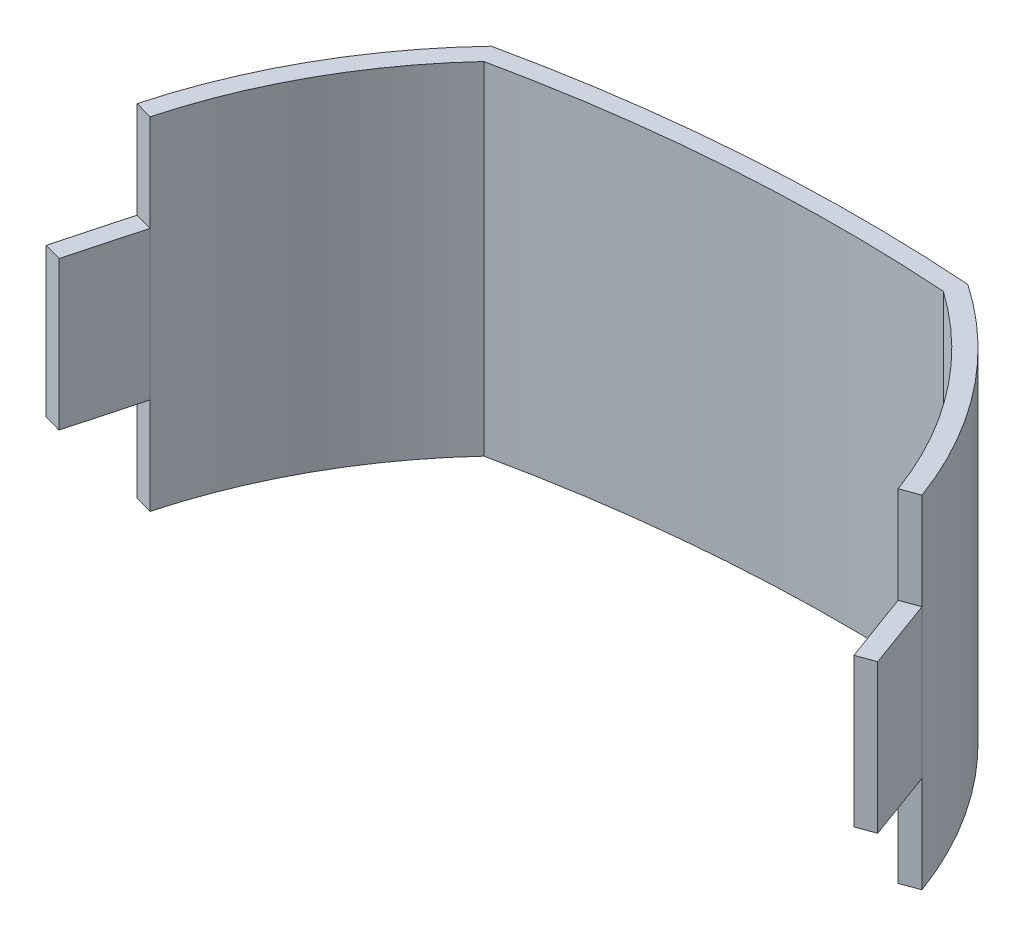
ISO-10303-21;
HEADER;
FILE_DESCRIPTION(('STEP AP214'),'2;1');
FILE_NAME('part.step','',(''),(''),'','','');
FILE_SCHEMA(('AUTOMOTIVE_DESIGN { 1 0 10303 214 1 1 1 1 }'));
ENDSEC;
DATA;
#1=APPLICATION_CONTEXT('core data for automotive mechanical design processes');
#2=APPLICATION_PROTOCOL_DEFINITION('international standard','automotive_design',2000,#1);
#3=PRODUCT_CONTEXT('',#1,'mechanical');
#4=PRODUCT('Part','Part','',(#3));
#5=PRODUCT_RELATED_PRODUCT_CATEGORY('part','',(#4));
#6=PRODUCT_DEFINITION_FORMATION('','',#4);
#7=PRODUCT_DEFINITION_CONTEXT('part definition',#1,'design');
#8=PRODUCT_DEFINITION('design','',#6,#7);
#9=PRODUCT_DEFINITION_SHAPE('','',#8);
#10=(LENGTH_UNIT() NAMED_UNIT(*) SI_UNIT(.MILLI.,.METRE.));
#11=(NAMED_UNIT(*) PLANE_ANGLE_UNIT() SI_UNIT($,.RADIAN.));
#12=(NAMED_UNIT(*) SI_UNIT($,.STERADIAN.) SOLID_ANGLE_UNIT());
#13=UNCERTAINTY_MEASURE_WITH_UNIT(LENGTH_MEASURE(1.E-05),#10,'distance_accuracy_value','');
#14=(GEOMETRIC_REPRESENTATION_CONTEXT(3) GLOBAL_UNCERTAINTY_ASSIGNED_CONTEXT((#13)) GLOBAL_UNIT_ASSIGNED_CONTEXT((#10,
#11,#12)) REPRESENTATION_CONTEXT('',''));
#15=CARTESIAN_POINT('',(0.,0.,0.));
#16=DIRECTION('',(0.,0.,1.));
#17=DIRECTION('',(1.,0.,0.));
#18=AXIS2_PLACEMENT_3D('',#15,#16,#17);
#19=CARTESIAN_POINT('',(-5.40390390607862,4.6275,1.4488803415211));
#20=DIRECTION('',(-0.261218836370593,0.,0.965279606914594));
#21=DIRECTION('',(0.965279606914594,0.,0.261218836370593));
#22=AXIS2_PLACEMENT_3D('',#19,#20,#21);
#23=PLANE('',#22);
#24=DIRECTION('',(0.,1.,0.));
#25=VECTOR('',#24,1.);
#26=CARTESIAN_POINT('',(-5.39425111000948,5.6375,1.45149252988481));
#27=LINE('',#26,#25);
#28=CARTESIAN_POINT('',(-5.39425111000948,4.6375,1.45149252988481));
#29=VERTEX_POINT('',#28);
#30=CARTESIAN_POINT('',(-5.39425111000948,6.6375,1.45149252988481));
#31=VERTEX_POINT('',#30);
#32=EDGE_CURVE('E228',#29,#31,#27,.T.);
#33=ORIENTED_EDGE('',*,*,#32,.F.);
#34=DIRECTION('',(-0.965279606914593,0.,-0.261218836370596));
#35=VECTOR('',#34,1.);
#36=CARTESIAN_POINT('',(-5.15293120828083,4.6375,1.51679723897746));
#37=LINE('',#36,#35);
#38=CARTESIAN_POINT('',(-5.15293120828083,4.6375,1.51679723897746));
#39=VERTEX_POINT('',#38);
#40=EDGE_CURVE('E252',#39,#29,#37,.T.);
#41=ORIENTED_EDGE('',*,*,#40,.F.);
#42=DIRECTION('',(0.,-1.,0.));
#43=VECTOR('',#42,1.);
#44=CARTESIAN_POINT('',(-5.15293120828084,5.6375,1.51679723897746));
#45=LINE('',#44,#43);
#46=CARTESIAN_POINT('',(-5.15293120828083,6.6375,1.51679723897746));
#47=VERTEX_POINT('',#46);
#48=EDGE_CURVE('E244',#47,#39,#45,.T.);
#49=ORIENTED_EDGE('',*,*,#48,.F.);
#50=DIRECTION('',(0.965279606914593,0.,0.261218836370596));
#51=VECTOR('',#50,1.);
#52=CARTESIAN_POINT('',(-5.39425111000948,6.6375,1.45149252988481));
#53=LINE('',#52,#51);
#54=EDGE_CURVE('E21',#31,#47,#53,.T.);
#55=ORIENTED_EDGE('',*,*,#54,.F.);
#56=EDGE_LOOP('',(#33,#41,#49,#55));
#57=FACE_BOUND('',#56,.T.);
#58=ADVANCED_FACE('F17',(#57),#23,.T.);
#59=CARTESIAN_POINT('',(-5.40425111000948,6.6375,0.476212922970216));
#60=DIRECTION('',(0.,1.,0.));
#61=DIRECTION('',(0.,0.,1.));
#62=AXIS2_PLACEMENT_3D('',#59,#60,#61);
#63=PLANE('',#62);
#64=DIRECTION('',(0.965279606914591,0.,0.261218836370605));
#65=VECTOR('',#64,1.);
#66=CARTESIAN_POINT('',(-5.01237232277455,6.6375,0.518865277516542));
#67=LINE('',#66,#65);
#68=CARTESIAN_POINT('',(-5.13303227363887,6.6375,0.486212922970215));
#69=VERTEX_POINT('',#68);
#70=CARTESIAN_POINT('',(-4.89171237191023,6.6375,0.551517632062868));
#71=VERTEX_POINT('',#70);
#72=EDGE_CURVE('E216',#69,#71,#67,.T.);
#73=ORIENTED_EDGE('',*,*,#72,.F.);
#74=DIRECTION('',(0.2612188363706,0.,-0.965279606914592));
#75=VECTOR('',#74,1.);
#76=CARTESIAN_POINT('',(-5.26364169182418,6.6375,0.96885272642751));
#77=LINE('',#76,#75);
#78=EDGE_CURVE('E225',#31,#69,#77,.T.);
#79=ORIENTED_EDGE('',*,*,#78,.F.);
#80=ORIENTED_EDGE('',*,*,#54,.T.);
#81=DIRECTION('',(-0.261218836370607,0.,0.96527960691459));
#82=VECTOR('',#81,1.);
#83=CARTESIAN_POINT('',(-5.02232179009553,6.6375,1.03415743552016));
#84=LINE('',#83,#82);
#85=EDGE_CURVE('E122',#71,#47,#84,.T.);
#86=ORIENTED_EDGE('',*,*,#85,.F.);
#87=EDGE_LOOP('',(#73,#79,#80,#86));
#88=FACE_BOUND('',#87,.T.);
#89=ADVANCED_FACE('F318',(#88),#63,.T.);
#90=CARTESIAN_POINT('',(-5.15554339664454,4.6275,1.5264500350466));
#91=DIRECTION('',(0.96527960691459,0.,0.261218836370607));
#92=DIRECTION('',(0.261218836370607,0.,-0.96527960691459));
#93=AXIS2_PLACEMENT_3D('',#90,#91,#92);
#94=PLANE('',#93);
#95=ORIENTED_EDGE('',*,*,#48,.T.);
#96=DIRECTION('',(-0.261218836370599,0.,0.965279606914592));
#97=VECTOR('',#96,1.);
#98=CARTESIAN_POINT('',(-4.89171237191023,4.6375,0.551517632062866));
#99=LINE('',#98,#97);
#100=CARTESIAN_POINT('',(-4.89171237191023,4.6375,0.551517632062867));
#101=VERTEX_POINT('',#100);
#102=EDGE_CURVE('E249',#101,#39,#99,.T.);
#103=ORIENTED_EDGE('',*,*,#102,.F.);
#104=DIRECTION('',(0.,-1.,0.));
#105=VECTOR('',#104,1.);
#106=CARTESIAN_POINT('',(-4.89171237191023,5.6375,0.551517632062868));
#107=LINE('',#106,#105);
#108=EDGE_CURVE('E203',#71,#101,#107,.T.);
#109=ORIENTED_EDGE('',*,*,#108,.F.);
#110=ORIENTED_EDGE('',*,*,#85,.T.);
#111=EDGE_LOOP('',(#95,#103,#109,#110));
#112=FACE_BOUND('',#111,.T.);
#113=ADVANCED_FACE('F317',(#112),#94,.T.);
#114=CARTESIAN_POINT('',(-5.40425111000948,4.6375,1.52679723897746));
#115=DIRECTION('',(0.,-1.,0.));
#116=DIRECTION('',(0.,0.,-1.));
#117=AXIS2_PLACEMENT_3D('',#114,#115,#116);
#118=PLANE('',#117);
#119=DIRECTION('',(-0.965279606914591,0.,-0.261218836370605));
#120=VECTOR('',#119,1.);
#121=CARTESIAN_POINT('',(-5.01237232277455,4.6375,0.518865277516542));
#122=LINE('',#121,#120);
#123=CARTESIAN_POINT('',(-5.13303227363887,4.6375,0.486212922970215));
#124=VERTEX_POINT('',#123);
#125=EDGE_CURVE('E188',#101,#124,#122,.T.);
#126=ORIENTED_EDGE('',*,*,#125,.F.);
#127=ORIENTED_EDGE('',*,*,#102,.T.);
#128=ORIENTED_EDGE('',*,*,#40,.T.);
#129=DIRECTION('',(-0.2612188363706,0.,0.965279606914592));
#130=VECTOR('',#129,1.);
#131=CARTESIAN_POINT('',(-5.26364169182418,4.6375,0.96885272642751));
#132=LINE('',#131,#130);
#133=EDGE_CURVE('E218',#124,#29,#132,.T.);
#134=ORIENTED_EDGE('',*,*,#133,.F.);
#135=EDGE_LOOP('',(#126,#127,#128,#134));
#136=FACE_BOUND('',#135,.T.);
#137=ADVANCED_FACE('F299',(#136),#118,.T.);
#138=CARTESIAN_POINT('',(-5.13042008527517,4.6275,0.47656012690107));
#139=DIRECTION('',(-0.965279606914592,0.,-0.2612188363706));
#140=DIRECTION('',(-0.2612188363706,0.,0.965279606914592));
#141=AXIS2_PLACEMENT_3D('',#138,#139,#140);
#142=PLANE('',#141);
#143=DIRECTION('',(0.,1.,0.));
#144=VECTOR('',#143,1.);
#145=CARTESIAN_POINT('',(-5.13303227363887,5.6375,0.486212922970215));
#146=LINE('',#145,#144);
#147=EDGE_CURVE('E182',#124,#69,#146,.T.);
#148=ORIENTED_EDGE('',*,*,#147,.F.);
#149=ORIENTED_EDGE('',*,*,#133,.T.);
#150=ORIENTED_EDGE('',*,*,#32,.T.);
#151=ORIENTED_EDGE('',*,*,#78,.T.);
#152=EDGE_LOOP('',(#148,#149,#150,#151));
#153=FACE_BOUND('',#152,.T.);
#154=ADVANCED_FACE('F302',(#153),#142,.T.);
#155=CARTESIAN_POINT('',(-5.14268506970802,6.6275,0.48360073460651));
#156=DIRECTION('',(-0.261218836370605,0.,0.965279606914591));
#157=DIRECTION('',(0.965279606914591,0.,0.261218836370605));
#158=AXIS2_PLACEMENT_3D('',#155,#156,#157);
#159=PLANE('',#158);
#160=DIRECTION('',(-0.965279606914591,0.,-0.261218836370605));
#161=VECTOR('',#160,1.);
#162=CARTESIAN_POINT('',(-5.01237232277455,7.9375,0.518865277516542));
#163=LINE('',#162,#161);
#164=CARTESIAN_POINT('',(-4.89171237191023,7.9375,0.551517632062867));
#165=VERTEX_POINT('',#164);
#166=CARTESIAN_POINT('',(-5.13303227363887,7.9375,0.486212922970217));
#167=VERTEX_POINT('',#166);
#168=EDGE_CURVE('E192',#165,#167,#163,.T.);
#169=ORIENTED_EDGE('',*,*,#168,.T.);
#170=DIRECTION('',(0.,1.,0.));
#171=VECTOR('',#170,1.);
#172=CARTESIAN_POINT('',(-5.13303227363887,5.6375,0.486212922970215));
#173=LINE('',#172,#171);
#174=EDGE_CURVE('E195',#69,#167,#173,.T.);
#175=ORIENTED_EDGE('',*,*,#174,.F.);
#176=ORIENTED_EDGE('',*,*,#72,.T.);
#177=DIRECTION('',(0.,-1.,0.));
#178=VECTOR('',#177,1.);
#179=CARTESIAN_POINT('',(-4.89171237191023,5.6375,0.551517632062868));
#180=LINE('',#179,#178);
#181=EDGE_CURVE('E191',#165,#71,#180,.T.);
#182=ORIENTED_EDGE('',*,*,#181,.F.);
#183=EDGE_LOOP('',(#169,#175,#176,#182));
#184=FACE_BOUND('',#183,.T.);
#185=ADVANCED_FACE('F320',(#184),#159,.T.);
#186=CARTESIAN_POINT('',(1.0688438005162,3.33750000000002,18.039308959663));
#187=DIRECTION('',(0.,1.,0.));
#188=DIRECTION('',(0.,0.,1.));
#189=AXIS2_PLACEMENT_3D('',#186,#187,#188);
#190=CYLINDRICAL_SURFACE('',#189,20.8381908625006);
#191=DIRECTION('',(0.,1.,0.));
#192=VECTOR('',#191,1.);
#193=CARTESIAN_POINT('',(-3.29059030303117,5.6375,-2.33777455881025));
#194=LINE('',#193,#192);
#195=CARTESIAN_POINT('',(-3.29059030303118,3.3375,-2.33777455881024));
#196=VERTEX_POINT('',#195);
#197=CARTESIAN_POINT('',(-3.29059030303118,7.9375,-2.33777455881025));
#198=VERTEX_POINT('',#197);
#199=EDGE_CURVE('E189',#196,#198,#194,.T.);
#200=ORIENTED_EDGE('',*,*,#199,.F.);
#201=CARTESIAN_POINT('',(1.0688438005162,3.33750000000002,18.039308959663));
#202=DIRECTION('',(0.,1.,0.));
#203=DIRECTION('',(0.,0.,1.));
#204=AXIS2_PLACEMENT_3D('',#201,#202,#203);
#205=CIRCLE('',#204,20.8381908625006);
#206=CARTESIAN_POINT('',(2.47895784346587,3.3375,-2.75111616364513));
#207=VERTEX_POINT('',#206);
#208=EDGE_CURVE('E275',#207,#196,#205,.T.);
#209=ORIENTED_EDGE('',*,*,#208,.F.);
#210=DIRECTION('',(0.,-1.,0.));
#211=VECTOR('',#210,1.);
#212=CARTESIAN_POINT('',(2.47895784346586,5.6375,-2.75111616364514));
#213=LINE('',#212,#211);
#214=CARTESIAN_POINT('',(2.47895784346587,7.9375,-2.75111616364513));
#215=VERTEX_POINT('',#214);
#216=EDGE_CURVE('E193',#215,#207,#213,.T.);
#217=ORIENTED_EDGE('',*,*,#216,.F.);
#218=CARTESIAN_POINT('',(1.0688438005162,7.93750000000002,18.039308959663));
#219=DIRECTION('',(0.,1.,0.));
#220=DIRECTION('',(0.,0.,1.));
#221=AXIS2_PLACEMENT_3D('',#218,#219,#220);
#222=CIRCLE('',#221,20.8381908625006);
#223=EDGE_CURVE('E284',#198,#215,#222,.F.);
#224=ORIENTED_EDGE('',*,*,#223,.F.);
#225=EDGE_LOOP('',(#200,#209,#217,#224));
#226=FACE_BOUND('',#225,.T.);
#227=ADVANCED_FACE('F334',(#226),#190,.F.);
#228=CARTESIAN_POINT('',(1.76789829440619,3.3375,2.35370607204965));
#229=DIRECTION('',(0.,1.,0.));
#230=DIRECTION('',(0.,0.,1.));
#231=AXIS2_PLACEMENT_3D('',#228,#229,#230);
#232=CYLINDRICAL_SURFACE('',#231,6.89915193340003);
#233=DIRECTION('',(0.,1.,0.));
#234=VECTOR('',#233,1.);
#235=CARTESIAN_POINT('',(-4.89171237191023,3.9875,0.551517632062866));
#236=LINE('',#235,#234);
#237=CARTESIAN_POINT('',(-4.89171237191023,3.3375,0.551517632062866));
#238=VERTEX_POINT('',#237);
#239=EDGE_CURVE('E183',#238,#101,#236,.T.);
#240=ORIENTED_EDGE('',*,*,#239,.F.);
#241=CARTESIAN_POINT('',(1.76789829440619,3.3375,2.35370607204965));
#242=DIRECTION('',(0.,1.,0.));
#243=DIRECTION('',(0.,0.,1.));
#244=AXIS2_PLACEMENT_3D('',#241,#242,#243);
#245=CIRCLE('',#244,6.89915193340003);
#246=EDGE_CURVE('E272',#196,#238,#245,.T.);
#247=ORIENTED_EDGE('',*,*,#246,.F.);
#248=ORIENTED_EDGE('',*,*,#199,.T.);
#249=CARTESIAN_POINT('',(1.76789829440619,7.9375,2.35370607204965));
#250=DIRECTION('',(0.,1.,0.));
#251=DIRECTION('',(0.,0.,1.));
#252=AXIS2_PLACEMENT_3D('',#249,#250,#251);
#253=CIRCLE('',#252,6.89915193340003);
#254=EDGE_CURVE('E287',#165,#198,#253,.F.);
#255=ORIENTED_EDGE('',*,*,#254,.F.);
#256=ORIENTED_EDGE('',*,*,#181,.T.);
#257=ORIENTED_EDGE('',*,*,#108,.T.);
#258=EDGE_LOOP('',(#240,#247,#248,#255,#256,#257));
#259=FACE_BOUND('',#258,.T.);
#260=ADVANCED_FACE('F312',(#259),#232,.F.);
#261=CARTESIAN_POINT('',(-5.14268506970802,3.3275,0.48360073460651));
#262=DIRECTION('',(-0.261218836370605,0.,0.965279606914591));
#263=DIRECTION('',(0.965279606914591,0.,0.261218836370605));
#264=AXIS2_PLACEMENT_3D('',#261,#262,#263);
#265=PLANE('',#264);
#266=DIRECTION('',(-0.96527960691459,0.,-0.261218836370606));
#267=VECTOR('',#266,1.);
#268=CARTESIAN_POINT('',(-4.89171237191023,3.3375,0.551517632062866));
#269=LINE('',#268,#267);
#270=CARTESIAN_POINT('',(-5.13303227363887,3.3375,0.486212922970216));
#271=VERTEX_POINT('',#270);
#272=EDGE_CURVE('E269',#238,#271,#269,.T.);
#273=ORIENTED_EDGE('',*,*,#272,.F.);
#274=ORIENTED_EDGE('',*,*,#239,.T.);
#275=ORIENTED_EDGE('',*,*,#125,.T.);
#276=DIRECTION('',(0.,1.,0.));
#277=VECTOR('',#276,1.);
#278=CARTESIAN_POINT('',(-5.13303227363887,5.6375,0.486212922970215));
#279=LINE('',#278,#277);
#280=EDGE_CURVE('E179',#271,#124,#279,.T.);
#281=ORIENTED_EDGE('',*,*,#280,.F.);
#282=EDGE_LOOP('',(#273,#274,#275,#281));
#283=FACE_BOUND('',#282,.T.);
#284=ADVANCED_FACE('F309',(#283),#265,.T.);
#285=CARTESIAN_POINT('',(1.76789829440614,7.9375,2.35370607204963));
#286=DIRECTION('',(0.,-1.,0.));
#287=DIRECTION('',(0.,0.,-1.));
#288=AXIS2_PLACEMENT_3D('',#285,#286,#287);
#289=CYLINDRICAL_SURFACE('',#288,7.14915193339997);
#290=DIRECTION('',(0.,1.,0.));
#291=VECTOR('',#290,1.);
#292=CARTESIAN_POINT('',(-3.41958208755805,5.6375,-2.56568623326342));
#293=LINE('',#292,#291);
#294=CARTESIAN_POINT('',(-3.41958208755805,3.3375,-2.56568623326342));
#295=VERTEX_POINT('',#294);
#296=CARTESIAN_POINT('',(-3.41958208755805,7.9375,-2.56568623326342));
#297=VERTEX_POINT('',#296);
#298=EDGE_CURVE('E175',#295,#297,#293,.T.);
#299=ORIENTED_EDGE('',*,*,#298,.F.);
#300=CARTESIAN_POINT('',(1.76789829440614,3.3375,2.35370607204963));
#301=DIRECTION('',(0.,-1.,0.));
#302=DIRECTION('',(0.,0.,-1.));
#303=AXIS2_PLACEMENT_3D('',#300,#301,#302);
#304=CIRCLE('',#303,7.14915193339997);
#305=EDGE_CURVE('E266',#271,#295,#304,.T.);
#306=ORIENTED_EDGE('',*,*,#305,.F.);
#307=ORIENTED_EDGE('',*,*,#280,.T.);
#308=ORIENTED_EDGE('',*,*,#147,.T.);
#309=ORIENTED_EDGE('',*,*,#174,.T.);
#310=CARTESIAN_POINT('',(1.76789829440614,7.9375,2.35370607204963));
#311=DIRECTION('',(0.,-1.,0.));
#312=DIRECTION('',(0.,0.,-1.));
#313=AXIS2_PLACEMENT_3D('',#310,#311,#312);
#314=CIRCLE('',#313,7.14915193339997);
#315=EDGE_CURVE('E290',#297,#167,#314,.F.);
#316=ORIENTED_EDGE('',*,*,#315,.F.);
#317=EDGE_LOOP('',(#299,#306,#307,#308,#309,#316));
#318=FACE_BOUND('',#317,.T.);
#319=ADVANCED_FACE('F306',(#318),#289,.T.);
#320=CARTESIAN_POINT('',(-0.683450746203608,3.3375,1.74334118705939));
#321=DIRECTION('',(0.,1.,0.));
#322=DIRECTION('',(-1.,0.,0.));
#323=AXIS2_PLACEMENT_3D('',#320,#321,#322);
#324=CYLINDRICAL_SURFACE('',#323,5.49554137144988);
#325=DIRECTION('',(0.,1.,0.));
#326=VECTOR('',#325,1.);
#327=CARTESIAN_POINT('',(4.47722332298391,5.6375,-0.14568451867697));
#328=LINE('',#327,#326);
#329=CARTESIAN_POINT('',(4.47722332298391,3.3375,-0.14568451867697));
#330=VERTEX_POINT('',#329);
#331=CARTESIAN_POINT('',(4.47722332298391,4.6375,-0.14568451867697));
#332=VERTEX_POINT('',#331);
#333=EDGE_CURVE('E178',#330,#332,#328,.T.);
#334=ORIENTED_EDGE('',*,*,#333,.T.);
#335=DIRECTION('',(0.,-1.,0.));
#336=VECTOR('',#335,1.);
#337=CARTESIAN_POINT('',(4.47722332298391,5.6375,-0.14568451867697));
#338=LINE('',#337,#336);
#339=CARTESIAN_POINT('',(4.47722332298391,6.6375,-0.14568451867697));
#340=VERTEX_POINT('',#339);
#341=EDGE_CURVE('E211',#340,#332,#338,.T.);
#342=ORIENTED_EDGE('',*,*,#341,.F.);
#343=DIRECTION('',(0.,-1.,0.));
#344=VECTOR('',#343,1.);
#345=CARTESIAN_POINT('',(4.47722332298391,7.2875,-0.14568451867697));
#346=LINE('',#345,#344);
#347=CARTESIAN_POINT('',(4.47722332298391,7.9375,-0.145684518676971));
#348=VERTEX_POINT('',#347);
#349=EDGE_CURVE('E173',#348,#340,#346,.T.);
#350=ORIENTED_EDGE('',*,*,#349,.F.);
#351=CARTESIAN_POINT('',(-0.683450746203605,7.9375,1.74334118705939));
#352=DIRECTION('',(0.,1.,0.));
#353=DIRECTION('',(-1.,0.,0.));
#354=AXIS2_PLACEMENT_3D('',#351,#352,#353);
#355=CIRCLE('',#354,5.49554137144988);
#356=EDGE_CURVE('E254',#215,#348,#355,.F.);
#357=ORIENTED_EDGE('',*,*,#356,.F.);
#358=ORIENTED_EDGE('',*,*,#216,.T.);
#359=CARTESIAN_POINT('',(-0.683450746203608,3.3375,1.74334118705939));
#360=DIRECTION('',(0.,1.,0.));
#361=DIRECTION('',(-1.,0.,0.));
#362=AXIS2_PLACEMENT_3D('',#359,#360,#361);
#363=CIRCLE('',#362,5.49554137144988);
#364=EDGE_CURVE('E278',#330,#207,#363,.T.);
#365=ORIENTED_EDGE('',*,*,#364,.F.);
#366=EDGE_LOOP('',(#334,#342,#350,#357,#358,#365));
#367=FACE_BOUND('',#366,.T.);
#368=ADVANCED_FACE('F340',(#367),#324,.F.);
#369=CARTESIAN_POINT('',(1.06884380051626,7.9375,18.0393089596635));
#370=DIRECTION('',(0.,-1.,0.));
#371=DIRECTION('',(0.,0.,-1.));
#372=AXIS2_PLACEMENT_3D('',#369,#370,#371);
#373=CYLINDRICAL_SURFACE('',#372,21.0881908625012);
#374=DIRECTION('',(0.,1.,0.));
#375=VECTOR('',#374,1.);
#376=CARTESIAN_POINT('',(2.56498576320767,5.6375,-2.99574162455785));
#377=LINE('',#376,#375);
#378=CARTESIAN_POINT('',(2.56498576320767,3.3375,-2.99574162455785));
#379=VERTEX_POINT('',#378);
#380=CARTESIAN_POINT('',(2.56498576320767,7.9375,-2.99574162455785));
#381=VERTEX_POINT('',#380);
#382=EDGE_CURVE('E162',#379,#381,#377,.T.);
#383=ORIENTED_EDGE('',*,*,#382,.F.);
#384=CARTESIAN_POINT('',(1.06884380051626,3.3375,18.0393089596635));
#385=DIRECTION('',(0.,-1.,0.));
#386=DIRECTION('',(0.,0.,-1.));
#387=AXIS2_PLACEMENT_3D('',#384,#385,#386);
#388=CIRCLE('',#387,21.0881908625012);
#389=EDGE_CURVE('E214',#295,#379,#388,.T.);
#390=ORIENTED_EDGE('',*,*,#389,.F.);
#391=ORIENTED_EDGE('',*,*,#298,.T.);
#392=CARTESIAN_POINT('',(1.06884380051626,7.9375,18.0393089596635));
#393=DIRECTION('',(0.,-1.,0.));
#394=DIRECTION('',(0.,0.,-1.));
#395=AXIS2_PLACEMENT_3D('',#392,#393,#394);
#396=CIRCLE('',#395,21.0881908625012);
#397=EDGE_CURVE('E177',#381,#297,#396,.F.);
#398=ORIENTED_EDGE('',*,*,#397,.F.);
#399=EDGE_LOOP('',(#383,#390,#391,#398));
#400=FACE_BOUND('',#399,.T.);
#401=ADVANCED_FACE('F326',(#400),#373,.T.);
#402=CARTESIAN_POINT('',(-5.14303227363887,7.9375,0.561517632062868));
#403=DIRECTION('',(0.,1.,0.));
#404=DIRECTION('',(1.,0.,0.));
#405=AXIS2_PLACEMENT_3D('',#402,#403,#404);
#406=PLANE('',#405);
#407=ORIENTED_EDGE('',*,*,#223,.T.);
#408=ORIENTED_EDGE('',*,*,#356,.T.);
#409=DIRECTION('',(-0.939065638919211,0.,0.343737873678846));
#410=VECTOR('',#409,1.);
#411=CARTESIAN_POINT('',(4.59460652784881,7.9375,-0.188651752886827));
#412=LINE('',#411,#410);
#413=CARTESIAN_POINT('',(4.71198973271371,7.9375,-0.231618987096682));
#414=VERTEX_POINT('',#413);
#415=EDGE_CURVE('E170',#414,#348,#412,.T.);
#416=ORIENTED_EDGE('',*,*,#415,.F.);
#417=CARTESIAN_POINT('',(-0.683450746203531,7.9375,1.74334118705933));
#418=DIRECTION('',(0.,-1.,0.));
#419=DIRECTION('',(0.,0.,-1.));
#420=AXIS2_PLACEMENT_3D('',#417,#418,#419);
#421=CIRCLE('',#420,5.74554137144978);
#422=EDGE_CURVE('E165',#381,#414,#421,.T.);
#423=ORIENTED_EDGE('',*,*,#422,.F.);
#424=ORIENTED_EDGE('',*,*,#397,.T.);
#425=ORIENTED_EDGE('',*,*,#315,.T.);
#426=ORIENTED_EDGE('',*,*,#168,.F.);
#427=ORIENTED_EDGE('',*,*,#254,.T.);
#428=EDGE_LOOP('',(#407,#408,#416,#423,#424,#425,#426,#427));
#429=FACE_BOUND('',#428,.T.);
#430=ADVANCED_FACE('F323',(#429),#406,.T.);
#431=CARTESIAN_POINT('',(4.46783266659472,6.6275,-0.142247139940182));
#432=DIRECTION('',(0.343737873678846,0.,0.939065638919211));
#433=DIRECTION('',(0.939065638919211,0.,-0.343737873678846));
#434=AXIS2_PLACEMENT_3D('',#431,#432,#433);
#435=PLANE('',#434);
#436=ORIENTED_EDGE('',*,*,#415,.T.);
#437=ORIENTED_EDGE('',*,*,#349,.T.);
#438=DIRECTION('',(0.939065638919211,0.,-0.343737873678846));
#439=VECTOR('',#438,1.);
#440=CARTESIAN_POINT('',(4.59460652784881,6.6375,-0.188651752886827));
#441=LINE('',#440,#439);
#442=CARTESIAN_POINT('',(4.71198973292855,6.6375,-0.231618986509767));
#443=VERTEX_POINT('',#442);
#444=EDGE_CURVE('E174',#340,#443,#441,.T.);
#445=ORIENTED_EDGE('',*,*,#444,.T.);
#446=DIRECTION('',(0.,-1.,0.));
#447=VECTOR('',#446,1.);
#448=CARTESIAN_POINT('',(4.71198973271371,5.6375,-0.231618987096684));
#449=LINE('',#448,#447);
#450=EDGE_CURVE('E167',#414,#443,#449,.T.);
#451=ORIENTED_EDGE('',*,*,#450,.F.);
#452=EDGE_LOOP('',(#436,#437,#445,#451));
#453=FACE_BOUND('',#452,.T.);
#454=ADVANCED_FACE('F342',(#453),#435,.T.);
#455=CARTESIAN_POINT('',(4.72198973271371,3.3375,0.561517632062868));
#456=DIRECTION('',(0.,-1.,0.));
#457=DIRECTION('',(-1.,0.,0.));
#458=AXIS2_PLACEMENT_3D('',#455,#456,#457);
#459=PLANE('',#458);
#460=ORIENTED_EDGE('',*,*,#389,.T.);
#461=CARTESIAN_POINT('',(-0.683450746203531,3.3375,1.74334118705933));
#462=DIRECTION('',(0.,-1.,0.));
#463=DIRECTION('',(0.,0.,-1.));
#464=AXIS2_PLACEMENT_3D('',#461,#462,#463);
#465=CIRCLE('',#464,5.74554137144978);
#466=CARTESIAN_POINT('',(4.71198973271371,3.3375,-0.231618987096682));
#467=VERTEX_POINT('',#466);
#468=EDGE_CURVE('E169',#467,#379,#465,.F.);
#469=ORIENTED_EDGE('',*,*,#468,.F.);
#470=DIRECTION('',(-0.939065638919207,0.,0.343737873678856));
#471=VECTOR('',#470,1.);
#472=CARTESIAN_POINT('',(4.71198973271371,3.3375,-0.231618987096683));
#473=LINE('',#472,#471);
#474=EDGE_CURVE('E200',#467,#330,#473,.T.);
#475=ORIENTED_EDGE('',*,*,#474,.T.);
#476=ORIENTED_EDGE('',*,*,#364,.T.);
#477=ORIENTED_EDGE('',*,*,#208,.T.);
#478=ORIENTED_EDGE('',*,*,#246,.T.);
#479=ORIENTED_EDGE('',*,*,#272,.T.);
#480=ORIENTED_EDGE('',*,*,#305,.T.);
#481=EDGE_LOOP('',(#460,#469,#475,#476,#477,#478,#479,#480));
#482=FACE_BOUND('',#481,.T.);
#483=ADVANCED_FACE('F330',(#482),#459,.T.);
#484=CARTESIAN_POINT('',(4.47378594424712,4.6275,-0.155075175066163));
#485=DIRECTION('',(-0.939065638919209,0.,0.343737873678851));
#486=DIRECTION('',(0.343737873678851,0.,0.939065638919209));
#487=AXIS2_PLACEMENT_3D('',#484,#485,#486);
#488=PLANE('',#487);
#489=ORIENTED_EDGE('',*,*,#341,.T.);
#490=DIRECTION('',(0.343737873678851,0.,0.939065638919209));
#491=VECTOR('',#490,1.);
#492=CARTESIAN_POINT('',(4.64909225982333,4.6375,0.323848300782634));
#493=LINE('',#492,#491);
#494=CARTESIAN_POINT('',(4.82096119783659,4.6375,0.793381119812566));
#495=VERTEX_POINT('',#494);
#496=EDGE_CURVE('E166',#332,#495,#493,.T.);
#497=ORIENTED_EDGE('',*,*,#496,.T.);
#498=DIRECTION('',(0.,-1.,0.));
#499=VECTOR('',#498,1.);
#500=CARTESIAN_POINT('',(4.82096119666276,5.6375,0.793381120242239));
#501=LINE('',#500,#499);
#502=CARTESIAN_POINT('',(4.82096119666276,6.6375,0.793381120242239));
#503=VERTEX_POINT('',#502);
#504=EDGE_CURVE('E146',#503,#495,#501,.T.);
#505=ORIENTED_EDGE('',*,*,#504,.F.);
#506=DIRECTION('',(0.34373787367885,0.,0.939065638919209));
#507=VECTOR('',#506,1.);
#508=CARTESIAN_POINT('',(4.47722332298391,6.6375,-0.14568451867697));
#509=LINE('',#508,#507);
#510=EDGE_CURVE('E142',#340,#503,#509,.T.);
#511=ORIENTED_EDGE('',*,*,#510,.F.);
#512=EDGE_LOOP('',(#489,#497,#505,#511));
#513=FACE_BOUND('',#512,.T.);
#514=ADVANCED_FACE('F351',(#513),#488,.T.);
#515=CARTESIAN_POINT('',(-0.683450746203531,7.9375,1.74334118705933));
#516=DIRECTION('',(0.,-1.,0.));
#517=DIRECTION('',(0.,0.,-1.));
#518=AXIS2_PLACEMENT_3D('',#515,#516,#517);
#519=CYLINDRICAL_SURFACE('',#518,5.74554137144978);
#520=DIRECTION('',(0.,1.,0.));
#521=VECTOR('',#520,1.);
#522=CARTESIAN_POINT('',(4.71198973271371,3.9875,-0.231618987096681));
#523=LINE('',#522,#521);
#524=CARTESIAN_POINT('',(4.71198973271371,4.6375,-0.231618987096684));
#525=VERTEX_POINT('',#524);
#526=EDGE_CURVE('E158',#467,#525,#523,.T.);
#527=ORIENTED_EDGE('',*,*,#526,.F.);
#528=ORIENTED_EDGE('',*,*,#468,.T.);
#529=ORIENTED_EDGE('',*,*,#382,.T.);
#530=ORIENTED_EDGE('',*,*,#422,.T.);
#531=ORIENTED_EDGE('',*,*,#450,.T.);
#532=DIRECTION('',(0.,1.,0.));
#533=VECTOR('',#532,1.);
#534=CARTESIAN_POINT('',(4.71198973271372,5.6375,-0.231618987096686));
#535=LINE('',#534,#533);
#536=EDGE_CURVE('E36',#525,#443,#535,.T.);
#537=ORIENTED_EDGE('',*,*,#536,.F.);
#538=EDGE_LOOP('',(#527,#528,#529,#530,#531,#537));
#539=FACE_BOUND('',#538,.T.);
#540=ADVANCED_FACE('F343',(#539),#519,.T.);
#541=CARTESIAN_POINT('',(4.46722332298391,6.6375,-0.241618987096684));
#542=DIRECTION('',(0.,1.,0.));
#543=DIRECTION('',(0.,0.,1.));
#544=AXIS2_PLACEMENT_3D('',#541,#542,#543);
#545=PLANE('',#544);
#546=ORIENTED_EDGE('',*,*,#444,.F.);
#547=ORIENTED_EDGE('',*,*,#510,.T.);
#548=DIRECTION('',(-0.939065638919209,0.,0.343737873678851));
#549=VECTOR('',#548,1.);
#550=CARTESIAN_POINT('',(4.93834440152766,6.6375,0.750413886032382));
#551=LINE('',#550,#549);
#552=CARTESIAN_POINT('',(5.0557276040449,6.6375,0.70744665268187));
#553=VERTEX_POINT('',#552);
#554=EDGE_CURVE('E136',#553,#503,#551,.T.);
#555=ORIENTED_EDGE('',*,*,#554,.F.);
#556=DIRECTION('',(0.343737873678845,0.,0.939065638919211));
#557=VECTOR('',#556,1.);
#558=CARTESIAN_POINT('',(4.88385866955314,6.6375,0.23791383236292));
#559=LINE('',#558,#557);
#560=EDGE_CURVE('E140',#443,#553,#559,.T.);
#561=ORIENTED_EDGE('',*,*,#560,.F.);
#562=EDGE_LOOP('',(#546,#547,#555,#561));
#563=FACE_BOUND('',#562,.T.);
#564=ADVANCED_FACE('F138',(#563),#545,.T.);
#565=CARTESIAN_POINT('',(4.81157054027357,4.6275,0.796818498979027));
#566=DIRECTION('',(0.343737873678851,0.,0.939065638919209));
#567=DIRECTION('',(0.939065638919209,0.,-0.343737873678851));
#568=AXIS2_PLACEMENT_3D('',#565,#566,#567);
#569=PLANE('',#568);
#570=ORIENTED_EDGE('',*,*,#504,.T.);
#571=DIRECTION('',(0.939065638919209,0.,-0.343737873678851));
#572=VECTOR('',#571,1.);
#573=CARTESIAN_POINT('',(4.93834440152766,4.6375,0.750413886032382));
#574=LINE('',#573,#572);
#575=CARTESIAN_POINT('',(5.05572760639257,4.6375,0.707446651822525));
#576=VERTEX_POINT('',#575);
#577=EDGE_CURVE('E152',#495,#576,#574,.T.);
#578=ORIENTED_EDGE('',*,*,#577,.T.);
#579=DIRECTION('',(0.,-1.,0.));
#580=VECTOR('',#579,1.);
#581=CARTESIAN_POINT('',(5.05572760639256,5.6375,0.707446651822527));
#582=LINE('',#581,#580);
#583=EDGE_CURVE('E149',#553,#576,#582,.T.);
#584=ORIENTED_EDGE('',*,*,#583,.F.);
#585=ORIENTED_EDGE('',*,*,#554,.T.);
#586=EDGE_LOOP('',(#570,#578,#584,#585));
#587=FACE_BOUND('',#586,.T.);
#588=ADVANCED_FACE('F150',(#587),#569,.T.);
#589=CARTESIAN_POINT('',(4.46783266659472,3.3275,-0.142247139940182));
#590=DIRECTION('',(0.343737873678846,0.,0.939065638919211));
#591=DIRECTION('',(0.939065638919211,0.,-0.343737873678846));
#592=AXIS2_PLACEMENT_3D('',#589,#590,#591);
#593=PLANE('',#592);
#594=ORIENTED_EDGE('',*,*,#474,.F.);
#595=ORIENTED_EDGE('',*,*,#526,.T.);
#596=DIRECTION('',(0.939065638919206,0.,-0.343737873678859));
#597=VECTOR('',#596,1.);
#598=CARTESIAN_POINT('',(4.47722332298391,4.6375,-0.14568451867697));
#599=LINE('',#598,#597);
#600=EDGE_CURVE('E27',#332,#525,#599,.T.);
#601=ORIENTED_EDGE('',*,*,#600,.F.);
#602=ORIENTED_EDGE('',*,*,#333,.F.);
#603=EDGE_LOOP('',(#594,#595,#601,#602));
#604=FACE_BOUND('',#603,.T.);
#605=ADVANCED_FACE('F346',(#604),#593,.T.);
#606=CARTESIAN_POINT('',(5.05916498512935,4.6275,0.716837308211717));
#607=DIRECTION('',(0.939065638919211,0.,-0.343737873678845));
#608=DIRECTION('',(-0.343737873678845,0.,-0.939065638919211));
#609=AXIS2_PLACEMENT_3D('',#606,#607,#608);
#610=PLANE('',#609);
#611=ORIENTED_EDGE('',*,*,#583,.T.);
#612=DIRECTION('',(0.343737873678859,0.,0.939065638919206));
#613=VECTOR('',#612,1.);
#614=CARTESIAN_POINT('',(4.71198973271371,4.6375,-0.231618987096683));
#615=LINE('',#614,#613);
#616=EDGE_CURVE('E11',#525,#576,#615,.T.);
#617=ORIENTED_EDGE('',*,*,#616,.F.);
#618=ORIENTED_EDGE('',*,*,#536,.T.);
#619=ORIENTED_EDGE('',*,*,#560,.T.);
#620=EDGE_LOOP('',(#611,#617,#618,#619));
#621=FACE_BOUND('',#620,.T.);
#622=ADVANCED_FACE('F156',(#621),#610,.T.);
#623=CARTESIAN_POINT('',(4.46722332298391,4.6375,0.803381120242238));
#624=DIRECTION('',(0.,-1.,0.));
#625=DIRECTION('',(0.,0.,-1.));
#626=AXIS2_PLACEMENT_3D('',#623,#624,#625);
#627=PLANE('',#626);
#628=ORIENTED_EDGE('',*,*,#600,.T.);
#629=ORIENTED_EDGE('',*,*,#616,.T.);
#630=ORIENTED_EDGE('',*,*,#577,.F.);
#631=ORIENTED_EDGE('',*,*,#496,.F.);
#632=EDGE_LOOP('',(#628,#629,#630,#631));
#633=FACE_BOUND('',#632,.T.);
#634=ADVANCED_FACE('F19',(#633),#627,.T.);
#635=CLOSED_SHELL('',(#58,#89,#113,#137,#154,#185,#227,#260,#284,#319,#368,#401,#430,#454,#483,
#514,#540,#564,#588,#605,#622,#634));
#636=MANIFOLD_SOLID_BREP('B1',#635);
#637=ADVANCED_BREP_SHAPE_REPRESENTATION('',(#18,#636),#14);
#638=SHAPE_DEFINITION_REPRESENTATION(#9,#637);
ENDSEC;
END-ISO-10303-21;
